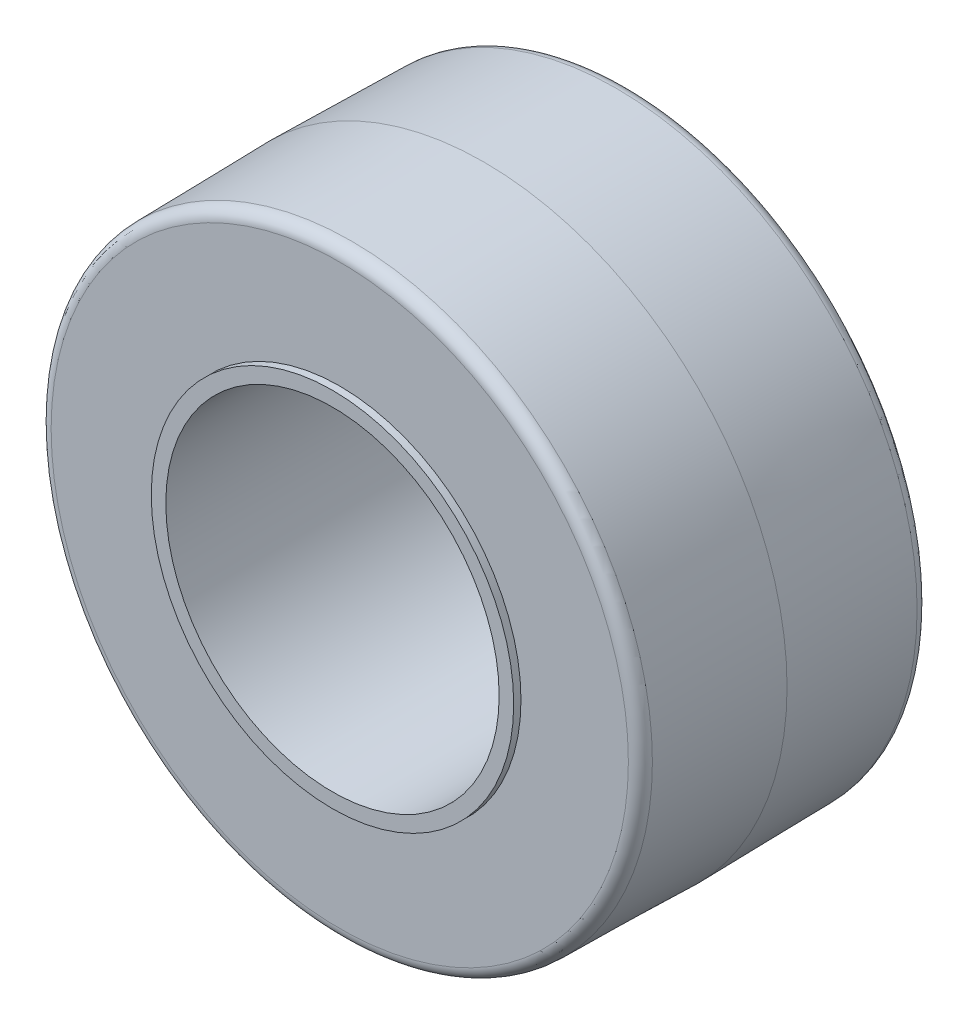
ISO-10303-21;
HEADER;
FILE_DESCRIPTION(('STEP AP214'),'2;1');
FILE_NAME('part.step','',(''),(''),'','','');
FILE_SCHEMA(('AUTOMOTIVE_DESIGN { 1 0 10303 214 1 1 1 1 }'));
ENDSEC;
DATA;
#1=APPLICATION_CONTEXT('core data for automotive mechanical design processes');
#2=APPLICATION_PROTOCOL_DEFINITION('international standard','automotive_design',2000,#1);
#3=PRODUCT_CONTEXT('',#1,'mechanical');
#4=PRODUCT('Part','Part','',(#3));
#5=PRODUCT_RELATED_PRODUCT_CATEGORY('part','',(#4));
#6=PRODUCT_DEFINITION_FORMATION('','',#4);
#7=PRODUCT_DEFINITION_CONTEXT('part definition',#1,'design');
#8=PRODUCT_DEFINITION('design','',#6,#7);
#9=PRODUCT_DEFINITION_SHAPE('','',#8);
#10=(LENGTH_UNIT() NAMED_UNIT(*) SI_UNIT(.MILLI.,.METRE.));
#11=(NAMED_UNIT(*) PLANE_ANGLE_UNIT() SI_UNIT($,.RADIAN.));
#12=(NAMED_UNIT(*) SI_UNIT($,.STERADIAN.) SOLID_ANGLE_UNIT());
#13=UNCERTAINTY_MEASURE_WITH_UNIT(LENGTH_MEASURE(1.E-05),#10,'distance_accuracy_value','');
#14=(GEOMETRIC_REPRESENTATION_CONTEXT(3) GLOBAL_UNCERTAINTY_ASSIGNED_CONTEXT((#13)) GLOBAL_UNIT_ASSIGNED_CONTEXT((#10,
#11,#12)) REPRESENTATION_CONTEXT('',''));
#15=CARTESIAN_POINT('',(0.,0.,0.));
#16=DIRECTION('',(0.,0.,1.));
#17=DIRECTION('',(1.,0.,0.));
#18=AXIS2_PLACEMENT_3D('',#15,#16,#17);
#19=CARTESIAN_POINT('',(29.464,-0.0635000000000046,-15.875));
#20=DIRECTION('',(0.,0.,-1.));
#21=DIRECTION('',(0.,-1.,0.));
#22=AXIS2_PLACEMENT_3D('',#19,#20,#21);
#23=PLANE('',#22);
#24=CARTESIAN_POINT('',(29.464,-17.526,-15.875));
#25=DIRECTION('',(0.,0.,-1.));
#26=DIRECTION('',(-1.,0.,0.));
#27=AXIS2_PLACEMENT_3D('',#24,#25,#26);
#28=CIRCLE('',#27,17.4625);
#29=CARTESIAN_POINT('',(12.0015,-17.526,-15.875));
#30=VERTEX_POINT('',#29);
#31=EDGE_CURVE('E94',#30,#30,#28,.T.);
#32=ORIENTED_EDGE('',*,*,#31,.F.);
#33=EDGE_LOOP('',(#32));
#34=FACE_BOUND('',#33,.T.);
#35=CARTESIAN_POINT('',(29.464,-17.526,-15.875));
#36=DIRECTION('',(0.,0.,-1.));
#37=DIRECTION('',(-1.,0.,0.));
#38=AXIS2_PLACEMENT_3D('',#35,#36,#37);
#39=CIRCLE('',#38,18.9865);
#40=CARTESIAN_POINT('',(10.4775,-17.526,-15.875));
#41=VERTEX_POINT('',#40);
#42=EDGE_CURVE('E90',#41,#41,#39,.T.);
#43=ORIENTED_EDGE('',*,*,#42,.T.);
#44=EDGE_LOOP('',(#43));
#45=FACE_BOUND('',#44,.T.);
#46=ADVANCED_FACE('F47',(#34,#45),#23,.T.);
#47=CARTESIAN_POINT('',(29.464,12.7121760795829,-15.113));
#48=DIRECTION('',(0.,0.,-1.));
#49=DIRECTION('',(0.,-1.,0.));
#50=AXIS2_PLACEMENT_3D('',#47,#48,#49);
#51=PLANE('',#50);
#52=CARTESIAN_POINT('',(29.464,-17.526,-15.113));
#53=DIRECTION('',(0.,0.,-1.));
#54=DIRECTION('',(-1.,0.,0.));
#55=AXIS2_PLACEMENT_3D('',#52,#53,#54);
#56=CIRCLE('',#55,18.9865);
#57=CARTESIAN_POINT('',(10.4775,-17.526,-15.113));
#58=VERTEX_POINT('',#57);
#59=EDGE_CURVE('E86',#58,#58,#56,.T.);
#60=ORIENTED_EDGE('',*,*,#59,.F.);
#61=EDGE_LOOP('',(#60));
#62=FACE_BOUND('',#61,.T.);
#63=CARTESIAN_POINT('',(29.464,-17.526,-15.113));
#64=DIRECTION('',(0.,0.,-1.));
#65=DIRECTION('',(-1.,0.,0.));
#66=AXIS2_PLACEMENT_3D('',#63,#64,#65);
#67=CIRCLE('',#66,30.238176079583);
#68=CARTESIAN_POINT('',(-0.774176079583046,-17.526,-15.113));
#69=VERTEX_POINT('',#68);
#70=EDGE_CURVE('E76',#69,#69,#67,.T.);
#71=ORIENTED_EDGE('',*,*,#70,.T.);
#72=EDGE_LOOP('',(#71));
#73=FACE_BOUND('',#72,.T.);
#74=ADVANCED_FACE('F49',(#62,#73),#51,.T.);
#75=CARTESIAN_POINT('',(29.464,1.4605,15.113));
#76=DIRECTION('',(0.,0.,1.));
#77=DIRECTION('',(1.,0.,0.));
#78=AXIS2_PLACEMENT_3D('',#75,#76,#77);
#79=PLANE('',#78);
#80=CARTESIAN_POINT('',(29.464,-17.526,15.113));
#81=DIRECTION('',(0.,0.,-1.));
#82=DIRECTION('',(-1.,0.,0.));
#83=AXIS2_PLACEMENT_3D('',#80,#81,#82);
#84=CIRCLE('',#83,18.9865);
#85=CARTESIAN_POINT('',(10.4775,-17.526,15.113));
#86=VERTEX_POINT('',#85);
#87=EDGE_CURVE('E55',#86,#86,#84,.T.);
#88=ORIENTED_EDGE('',*,*,#87,.T.);
#89=EDGE_LOOP('',(#88));
#90=FACE_BOUND('',#89,.T.);
#91=CARTESIAN_POINT('',(29.464,-17.526,15.113));
#92=DIRECTION('',(0.,0.,-1.));
#93=DIRECTION('',(-1.,0.,0.));
#94=AXIS2_PLACEMENT_3D('',#91,#92,#93);
#95=CIRCLE('',#94,30.238176079583);
#96=CARTESIAN_POINT('',(-0.774176079583046,-17.526,15.113));
#97=VERTEX_POINT('',#96);
#98=EDGE_CURVE('E62',#97,#97,#95,.T.);
#99=ORIENTED_EDGE('',*,*,#98,.F.);
#100=EDGE_LOOP('',(#99));
#101=FACE_BOUND('',#100,.T.);
#102=ADVANCED_FACE('F127',(#90,#101),#79,.T.);
#103=CARTESIAN_POINT('',(29.464,1.4605,15.875));
#104=DIRECTION('',(0.,0.,1.));
#105=DIRECTION('',(1.,0.,0.));
#106=AXIS2_PLACEMENT_3D('',#103,#104,#105);
#107=PLANE('',#106);
#108=CARTESIAN_POINT('',(29.464,-17.526,15.875));
#109=DIRECTION('',(0.,0.,-1.));
#110=DIRECTION('',(-1.,0.,0.));
#111=AXIS2_PLACEMENT_3D('',#108,#109,#110);
#112=CIRCLE('',#111,17.4625);
#113=CARTESIAN_POINT('',(12.0015,-17.526,15.875));
#114=VERTEX_POINT('',#113);
#115=EDGE_CURVE('E98',#114,#114,#112,.T.);
#116=ORIENTED_EDGE('',*,*,#115,.T.);
#117=EDGE_LOOP('',(#116));
#118=FACE_BOUND('',#117,.T.);
#119=CARTESIAN_POINT('',(29.464,-17.526,15.875));
#120=DIRECTION('',(0.,0.,-1.));
#121=DIRECTION('',(-1.,0.,0.));
#122=AXIS2_PLACEMENT_3D('',#119,#120,#121);
#123=CIRCLE('',#122,18.9865);
#124=CARTESIAN_POINT('',(10.4775,-17.526,15.875));
#125=VERTEX_POINT('',#124);
#126=EDGE_CURVE('E10',#125,#125,#123,.T.);
#127=ORIENTED_EDGE('',*,*,#126,.F.);
#128=EDGE_LOOP('',(#127));
#129=FACE_BOUND('',#128,.T.);
#130=ADVANCED_FACE('F104',(#118,#129),#107,.T.);
#131=CARTESIAN_POINT('',(29.464,-17.526,0.));
#132=DIRECTION('',(0.,0.,-1.));
#133=DIRECTION('',(-1.,0.,0.));
#134=AXIS2_PLACEMENT_3D('',#131,#132,#133);
#135=CYLINDRICAL_SURFACE('',#134,18.9865);
#136=ORIENTED_EDGE('',*,*,#126,.T.);
#137=EDGE_LOOP('',(#136));
#138=FACE_BOUND('',#137,.T.);
#139=ORIENTED_EDGE('',*,*,#87,.F.);
#140=EDGE_LOOP('',(#139));
#141=FACE_BOUND('',#140,.T.);
#142=ADVANCED_FACE('F132',(#138,#141),#135,.T.);
#143=CARTESIAN_POINT('',(29.464,-17.526,13.843));
#144=DIRECTION('',(0.,0.,-1.));
#145=DIRECTION('',(-1.,0.,0.));
#146=AXIS2_PLACEMENT_3D('',#143,#144,#145);
#147=TOROIDAL_SURFACE('',#146,30.238176079583,1.27);
#148=ORIENTED_EDGE('',*,*,#98,.T.);
#149=EDGE_LOOP('',(#148));
#150=FACE_BOUND('',#149,.T.);
#151=CARTESIAN_POINT('',(29.464,-17.526,13.8651645561753));
#152=DIRECTION('',(0.,0.,-1.));
#153=DIRECTION('',(-1.,0.,0.));
#154=AXIS2_PLACEMENT_3D('',#151,#152,#153);
#155=CIRCLE('',#154,31.5079826524316);
#156=CARTESIAN_POINT('',(-2.04398265243165,-17.526,13.8651645561753));
#157=VERTEX_POINT('',#156);
#158=EDGE_CURVE('E68',#157,#157,#155,.T.);
#159=ORIENTED_EDGE('',*,*,#158,.F.);
#160=EDGE_LOOP('',(#159));
#161=FACE_BOUND('',#160,.T.);
#162=ADVANCED_FACE('F135',(#150,#161),#147,.T.);
#163=CARTESIAN_POINT('',(29.464,-17.526,0.));
#164=DIRECTION('',(0.,0.,-1.));
#165=DIRECTION('',(-1.,0.,0.));
#166=AXIS2_PLACEMENT_3D('',#163,#164,#165);
#167=CONICAL_SURFACE('',#166,31.75,0.0174532925199415);
#168=ORIENTED_EDGE('',*,*,#158,.T.);
#169=EDGE_LOOP('',(#168));
#170=FACE_BOUND('',#169,.T.);
#171=CARTESIAN_POINT('',(29.464,-17.526,0.));
#172=DIRECTION('',(0.,0.,-1.));
#173=DIRECTION('',(-1.,0.,0.));
#174=AXIS2_PLACEMENT_3D('',#171,#172,#173);
#175=CIRCLE('',#174,31.75);
#176=CARTESIAN_POINT('',(-2.286,-17.526,0.));
#177=VERTEX_POINT('',#176);
#178=EDGE_CURVE('E75',#177,#177,#175,.T.);
#179=ORIENTED_EDGE('',*,*,#178,.F.);
#180=EDGE_LOOP('',(#179));
#181=FACE_BOUND('',#180,.T.);
#182=ADVANCED_FACE('F139',(#170,#181),#167,.T.);
#183=CARTESIAN_POINT('',(29.464,-17.526,-13.8651645561753));
#184=DIRECTION('',(0.,0.,1.));
#185=DIRECTION('',(1.,0.,0.));
#186=AXIS2_PLACEMENT_3D('',#183,#184,#185);
#187=CONICAL_SURFACE('',#186,31.5079826524316,0.0174532925199415);
#188=CARTESIAN_POINT('',(29.464,-17.526,-13.8651645561753));
#189=DIRECTION('',(0.,0.,-1.));
#190=DIRECTION('',(-1.,0.,0.));
#191=AXIS2_PLACEMENT_3D('',#188,#189,#190);
#192=CIRCLE('',#191,31.5079826524316);
#193=CARTESIAN_POINT('',(-2.04398265243165,-17.526,-13.8651645561753));
#194=VERTEX_POINT('',#193);
#195=EDGE_CURVE('E71',#194,#194,#192,.T.);
#196=ORIENTED_EDGE('',*,*,#195,.F.);
#197=EDGE_LOOP('',(#196));
#198=FACE_BOUND('',#197,.T.);
#199=ORIENTED_EDGE('',*,*,#178,.T.);
#200=EDGE_LOOP('',(#199));
#201=FACE_BOUND('',#200,.T.);
#202=ADVANCED_FACE('F136',(#198,#201),#187,.T.);
#203=CARTESIAN_POINT('',(29.464,-17.526,-13.843));
#204=DIRECTION('',(0.,0.,-1.));
#205=DIRECTION('',(-1.,0.,0.));
#206=AXIS2_PLACEMENT_3D('',#203,#204,#205);
#207=TOROIDAL_SURFACE('',#206,30.238176079583,1.27);
#208=ORIENTED_EDGE('',*,*,#195,.T.);
#209=EDGE_LOOP('',(#208));
#210=FACE_BOUND('',#209,.T.);
#211=ORIENTED_EDGE('',*,*,#70,.F.);
#212=EDGE_LOOP('',(#211));
#213=FACE_BOUND('',#212,.T.);
#214=ADVANCED_FACE('F116',(#210,#213),#207,.T.);
#215=CARTESIAN_POINT('',(29.464,-17.526,0.));
#216=DIRECTION('',(0.,0.,-1.));
#217=DIRECTION('',(-1.,0.,0.));
#218=AXIS2_PLACEMENT_3D('',#215,#216,#217);
#219=CYLINDRICAL_SURFACE('',#218,18.9865);
#220=ORIENTED_EDGE('',*,*,#59,.T.);
#221=EDGE_LOOP('',(#220));
#222=FACE_BOUND('',#221,.T.);
#223=ORIENTED_EDGE('',*,*,#42,.F.);
#224=EDGE_LOOP('',(#223));
#225=FACE_BOUND('',#224,.T.);
#226=ADVANCED_FACE('F109',(#222,#225),#219,.T.);
#227=CARTESIAN_POINT('',(29.464,-17.526,0.));
#228=DIRECTION('',(0.,0.,-1.));
#229=DIRECTION('',(-1.,0.,0.));
#230=AXIS2_PLACEMENT_3D('',#227,#228,#229);
#231=CYLINDRICAL_SURFACE('',#230,17.4625);
#232=ORIENTED_EDGE('',*,*,#31,.T.);
#233=EDGE_LOOP('',(#232));
#234=FACE_BOUND('',#233,.T.);
#235=ORIENTED_EDGE('',*,*,#115,.F.);
#236=EDGE_LOOP('',(#235));
#237=FACE_BOUND('',#236,.T.);
#238=ADVANCED_FACE('F107',(#234,#237),#231,.F.);
#239=CLOSED_SHELL('',(#46,#74,#102,#130,#142,#162,#182,#202,#214,#226,#238));
#240=MANIFOLD_SOLID_BREP('B2',#239);
#241=ADVANCED_BREP_SHAPE_REPRESENTATION('',(#18,#240),#14);
#242=SHAPE_DEFINITION_REPRESENTATION(#9,#241);
ENDSEC;
END-ISO-10303-21;
